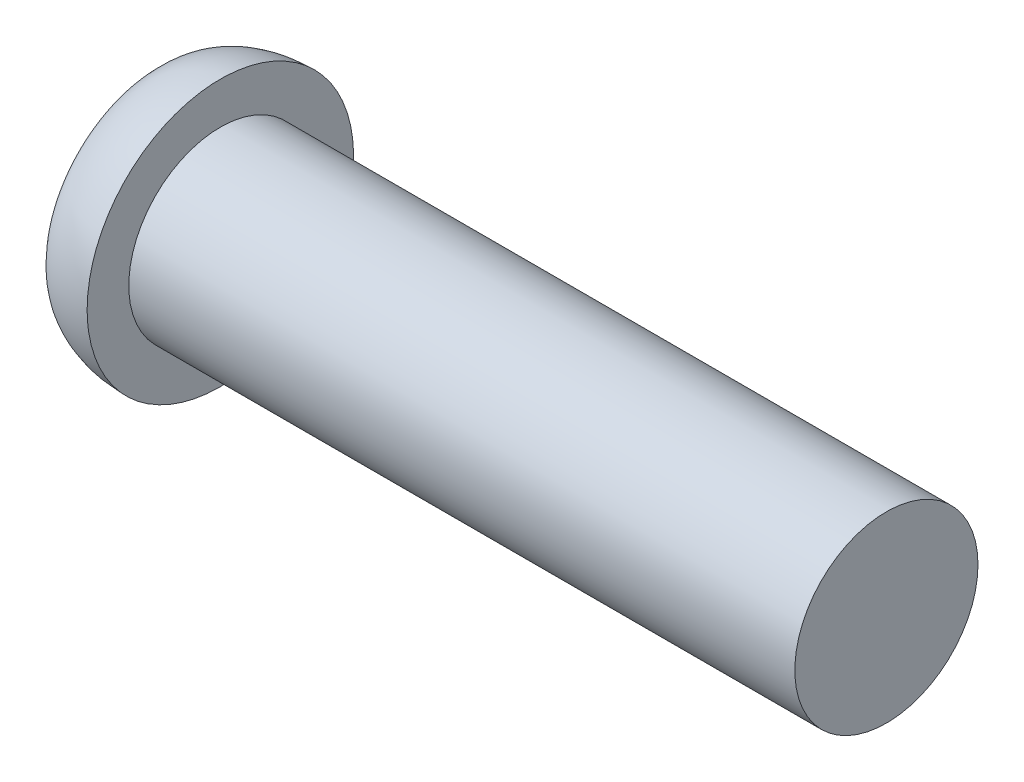
ISO-10303-21;
HEADER;
FILE_DESCRIPTION(('STEP AP214'),'2;1');
FILE_NAME('part.step','',(''),(''),'','','');
FILE_SCHEMA(('AUTOMOTIVE_DESIGN { 1 0 10303 214 1 1 1 1 }'));
ENDSEC;
DATA;
#1=APPLICATION_CONTEXT('core data for automotive mechanical design processes');
#2=APPLICATION_PROTOCOL_DEFINITION('international standard','automotive_design',2000,#1);
#3=PRODUCT_CONTEXT('',#1,'mechanical');
#4=PRODUCT('Part','Part','',(#3));
#5=PRODUCT_RELATED_PRODUCT_CATEGORY('part','',(#4));
#6=PRODUCT_DEFINITION_FORMATION('','',#4);
#7=PRODUCT_DEFINITION_CONTEXT('part definition',#1,'design');
#8=PRODUCT_DEFINITION('design','',#6,#7);
#9=PRODUCT_DEFINITION_SHAPE('','',#8);
#10=(LENGTH_UNIT() NAMED_UNIT(*) SI_UNIT(.MILLI.,.METRE.));
#11=(NAMED_UNIT(*) PLANE_ANGLE_UNIT() SI_UNIT($,.RADIAN.));
#12=(NAMED_UNIT(*) SI_UNIT($,.STERADIAN.) SOLID_ANGLE_UNIT());
#13=UNCERTAINTY_MEASURE_WITH_UNIT(LENGTH_MEASURE(1.E-05),#10,'distance_accuracy_value','');
#14=(GEOMETRIC_REPRESENTATION_CONTEXT(3) GLOBAL_UNCERTAINTY_ASSIGNED_CONTEXT((#13)) GLOBAL_UNIT_ASSIGNED_CONTEXT((#10,
#11,#12)) REPRESENTATION_CONTEXT('',''));
#15=CARTESIAN_POINT('',(0.,0.,0.));
#16=DIRECTION('',(0.,0.,1.));
#17=DIRECTION('',(1.,0.,0.));
#18=AXIS2_PLACEMENT_3D('',#15,#16,#17);
#19=CARTESIAN_POINT('',(20.,0.,0.));
#20=DIRECTION('',(-1.,0.,0.));
#21=DIRECTION('',(0.,0.,1.));
#22=AXIS2_PLACEMENT_3D('',#19,#20,#21);
#23=CYLINDRICAL_SURFACE('',#22,2.75);
#24=CARTESIAN_POINT('',(20.,0.,0.));
#25=DIRECTION('',(1.,0.,0.));
#26=DIRECTION('',(0.,0.,-1.));
#27=AXIS2_PLACEMENT_3D('',#24,#25,#26);
#28=CIRCLE('',#27,2.75);
#29=CARTESIAN_POINT('',(20.,0.,-2.75));
#30=VERTEX_POINT('',#29);
#31=EDGE_CURVE('E57',#30,#30,#28,.T.);
#32=ORIENTED_EDGE('',*,*,#31,.F.);
#33=EDGE_LOOP('',(#32));
#34=FACE_BOUND('',#33,.T.);
#35=CARTESIAN_POINT('',(0.,0.,0.));
#36=DIRECTION('',(1.,0.,0.));
#37=DIRECTION('',(0.,0.,-1.));
#38=AXIS2_PLACEMENT_3D('',#35,#36,#37);
#39=CIRCLE('',#38,2.75);
#40=CARTESIAN_POINT('',(0.,0.,-2.75));
#41=VERTEX_POINT('',#40);
#42=EDGE_CURVE('E63',#41,#41,#39,.T.);
#43=ORIENTED_EDGE('',*,*,#42,.T.);
#44=EDGE_LOOP('',(#43));
#45=FACE_BOUND('',#44,.T.);
#46=ADVANCED_FACE('F42',(#34,#45),#23,.T.);
#47=CARTESIAN_POINT('',(20.,0.,0.));
#48=DIRECTION('',(1.,0.,0.));
#49=DIRECTION('',(0.,0.,-1.));
#50=AXIS2_PLACEMENT_3D('',#47,#48,#49);
#51=PLANE('',#50);
#52=ORIENTED_EDGE('',*,*,#31,.T.);
#53=EDGE_LOOP('',(#52));
#54=FACE_BOUND('',#53,.T.);
#55=ADVANCED_FACE('F86',(#54),#51,.T.);
#56=CARTESIAN_POINT('',(-2.,0.,0.));
#57=DIRECTION('',(-1.,0.,0.));
#58=DIRECTION('',(0.,0.,1.));
#59=AXIS2_PLACEMENT_3D('',#56,#57,#58);
#60=PLANE('',#59);
#61=CARTESIAN_POINT('',(-2.,0.,3.));
#62=CARTESIAN_POINT('',(-2.,-0.392699074426904,3.));
#63=CARTESIAN_POINT('',(-2.,-0.785243659796482,2.92191802722197));
#64=CARTESIAN_POINT('',(-2.,-1.51085693439406,2.62135916784575));
#65=CARTESIAN_POINT('',(-2.,-1.84364016506699,2.3990005220523));
#66=CARTESIAN_POINT('',(-2.,-2.39900052205231,1.84364016506698));
#67=CARTESIAN_POINT('',(-2.,-2.62135916784575,1.51085693439406));
#68=CARTESIAN_POINT('',(-2.,-2.92191802722197,0.785243659796473));
#69=CARTESIAN_POINT('',(-2.,-3.,0.392699074426524));
#70=CARTESIAN_POINT('',(-2.,-3.,-0.392699074426515));
#71=CARTESIAN_POINT('',(-2.,-2.92191802722206,-0.785243659796482));
#72=CARTESIAN_POINT('',(-2.,-2.62135916784566,-1.51085693439406));
#73=CARTESIAN_POINT('',(-2.,-2.39900052205225,-1.84364016506695));
#74=CARTESIAN_POINT('',(-2.,-1.84364016506704,-2.39900052205233));
#75=CARTESIAN_POINT('',(-2.,-1.51085693439411,-2.62135916784572));
#76=CARTESIAN_POINT('',(-2.,-0.785243659796416,-2.921918027222));
#77=CARTESIAN_POINT('',(-2.,-0.392699074426519,-3.));
#78=CARTESIAN_POINT('',(-2.,0.392699074426519,-3.));
#79=CARTESIAN_POINT('',(-2.,0.78524365979651,-2.921918027222));
#80=CARTESIAN_POINT('',(-2.,1.51085693439404,-2.62135916784572));
#81=CARTESIAN_POINT('',(-2.,1.84364016506695,-2.39900052205233));
#82=CARTESIAN_POINT('',(-2.,2.39900052205233,-1.84364016506695));
#83=CARTESIAN_POINT('',(-2.,2.62135916784572,-1.51085693439408));
#84=CARTESIAN_POINT('',(-2.,2.921918027222,-0.785243659796464));
#85=CARTESIAN_POINT('',(-2.,3.,-0.392699074426519));
#86=CARTESIAN_POINT('',(-2.,3.,0.392699074426519));
#87=CARTESIAN_POINT('',(-2.,2.92191802722209,0.785243659796462));
#88=CARTESIAN_POINT('',(-2.,2.62135916784563,1.51085693439407));
#89=CARTESIAN_POINT('',(-2.,2.39900052205225,1.84364016506695));
#90=CARTESIAN_POINT('',(-2.,1.84364016506704,2.39900052205233));
#91=CARTESIAN_POINT('',(-2.,1.51085693439406,2.62135916784574));
#92=CARTESIAN_POINT('',(-2.,0.785243659796481,2.92191802722198));
#93=CARTESIAN_POINT('',(-2.,0.392699074426903,3.));
#94=CARTESIAN_POINT('',(-2.,0.,3.));
#95=(BOUNDED_CURVE() B_SPLINE_CURVE(3,(#61,#62,#63,#64,#65,#66,#67,#68,#69,#70,#71,#72,#73,#74,
#75,#76,#77,#78,#79,#80,#81,#82,#83,#84,#85,#86,#87,#88,#89,#90,#91,#92,#93,#94),.UNSPECIFIED.,
.T.,.F.) B_SPLINE_CURVE_WITH_KNOTS((4,2,2,2,2,2,2,2,2,2,2,2,2,2,2,2,4),(0.,0.392699081698725,
0.785398163397448,1.17809724509617,1.5707963267949,1.96349540849362,2.35619449019234,
2.74889357189107,3.14159265358979,3.53429173528852,3.92699081698724,4.31968989868597,
4.71238898038469,5.10508806208341,5.49778714378214,5.89048622548086,6.28318530717959),
.UNSPECIFIED.) CURVE() GEOMETRIC_REPRESENTATION_ITEM() RATIONAL_B_SPLINE_CURVE((1.,1.,1.,1.,1.,
1.,1.,1.,1.,1.,1.,1.,1.,1.,1.,1.,1.,1.,1.,1.,1.,1.,1.,1.,1.,1.,1.,1.,1.,1.,1.,1.,1.,1.)) REPRESENTATION_ITEM(''));
#96=CARTESIAN_POINT('',(-2.,0.,3.));
#97=VERTEX_POINT('',#96);
#98=EDGE_CURVE('E11',#97,#97,#95,.F.);
#99=ORIENTED_EDGE('',*,*,#98,.T.);
#100=EDGE_LOOP('',(#99));
#101=FACE_BOUND('',#100,.T.);
#102=ADVANCED_FACE('F77',(#101),#60,.T.);
#103=CARTESIAN_POINT('',(0.,0.,0.));
#104=DIRECTION('',(-1.,0.,0.));
#105=DIRECTION('',(0.,0.,1.));
#106=AXIS2_PLACEMENT_3D('',#103,#104,#105);
#107=PLANE('',#106);
#108=ORIENTED_EDGE('',*,*,#42,.F.);
#109=EDGE_LOOP('',(#108));
#110=FACE_BOUND('',#109,.T.);
#111=CARTESIAN_POINT('',(0.,0.,4.));
#112=CARTESIAN_POINT('',(0.,0.523598765902538,4.));
#113=CARTESIAN_POINT('',(0.,1.04699154639528,3.89589070296267));
#114=CARTESIAN_POINT('',(0.,2.01447591252544,3.49514555712762));
#115=CARTESIAN_POINT('',(0.,2.45818688675601,3.19866736273637));
#116=CARTESIAN_POINT('',(0.,3.19866736273637,2.45818688675601));
#117=CARTESIAN_POINT('',(0.,3.49514555712762,2.01447591252544));
#118=CARTESIAN_POINT('',(0.,3.89589070296267,1.04699154639527));
#119=CARTESIAN_POINT('',(0.,4.,0.523598765902026));
#120=CARTESIAN_POINT('',(0.,4.,-0.523598765902025));
#121=CARTESIAN_POINT('',(0.,3.89589070296266,-1.04699154639531));
#122=CARTESIAN_POINT('',(0.,3.49514555712764,-2.01447591252541));
#123=CARTESIAN_POINT('',(0.,3.19866736273646,-2.45818688675593));
#124=CARTESIAN_POINT('',(0.,2.45818688675592,-3.19866736273646));
#125=CARTESIAN_POINT('',(0.,2.01447591252541,-3.49514555712763));
#126=CARTESIAN_POINT('',(0.,1.04699154639532,-3.89589070296266));
#127=CARTESIAN_POINT('',(0.,0.523598765902026,-4.));
#128=CARTESIAN_POINT('',(0.,-0.523598765902025,-4.));
#129=CARTESIAN_POINT('',(0.,-1.04699154639527,-3.89589070296267));
#130=CARTESIAN_POINT('',(0.,-2.01447591252544,-3.49514555712762));
#131=CARTESIAN_POINT('',(0.,-2.45818688675597,-3.19866736273641));
#132=CARTESIAN_POINT('',(0.,-3.19866736273642,-2.45818688675596));
#133=CARTESIAN_POINT('',(0.,-3.49514555712761,-2.01447591252547));
#134=CARTESIAN_POINT('',(0.,-3.89589070296268,-1.04699154639526));
#135=CARTESIAN_POINT('',(0.,-4.,-0.52359876590202));
#136=CARTESIAN_POINT('',(0.,-4.,0.523598765902032));
#137=CARTESIAN_POINT('',(0.,-3.89589070296264,1.04699154639534));
#138=CARTESIAN_POINT('',(0.,-3.49514555712766,2.01447591252536));
#139=CARTESIAN_POINT('',(0.,-3.1986673627364,2.45818688675598));
#140=CARTESIAN_POINT('',(0.,-2.458186886756,3.19866736273638));
#141=CARTESIAN_POINT('',(0.,-2.01447591252544,3.49514555712762));
#142=CARTESIAN_POINT('',(0.,-1.04699154639529,3.89589070296267));
#143=CARTESIAN_POINT('',(0.,-0.523598765902538,4.));
#144=CARTESIAN_POINT('',(0.,0.,4.));
#145=(BOUNDED_CURVE() B_SPLINE_CURVE(3,(#111,#112,#113,#114,#115,#116,#117,#118,#119,#120,#121,
#122,#123,#124,#125,#126,#127,#128,#129,#130,#131,#132,#133,#134,#135,#136,#137,#138,#139,#140,
#141,#142,#143,#144),.UNSPECIFIED.,.T.,.F.) B_SPLINE_CURVE_WITH_KNOTS((4,2,2,2,2,2,2,2,2,2,2,2,
2,2,2,2,4),(0.,0.392699081698724,0.785398163397448,1.17809724509617,1.5707963267949,
1.96349540849362,2.35619449019234,2.74889357189107,3.14159265358979,3.53429173528852,
3.92699081698724,4.31968989868597,4.71238898038469,5.10508806208341,5.49778714378214,
5.89048622548086,6.28318530717959),
.UNSPECIFIED.) CURVE() GEOMETRIC_REPRESENTATION_ITEM() RATIONAL_B_SPLINE_CURVE((1.,1.,1.,1.,1.,
1.,1.,1.,1.,1.,1.,1.,1.,1.,1.,1.,1.,1.,1.,1.,1.,1.,1.,1.,1.,1.,1.,1.,1.,1.,1.,1.,1.,1.)) REPRESENTATION_ITEM(''));
#146=CARTESIAN_POINT('',(0.,0.,4.));
#147=VERTEX_POINT('',#146);
#148=EDGE_CURVE('E69',#147,#147,#145,.T.);
#149=ORIENTED_EDGE('',*,*,#148,.F.);
#150=EDGE_LOOP('',(#149));
#151=FACE_BOUND('',#150,.T.);
#152=ADVANCED_FACE('F85',(#110,#151),#107,.F.);
#153=CARTESIAN_POINT('',(-2.,0.,3.));
#154=CARTESIAN_POINT('',(-2.,0.392699074426903,3.));
#155=CARTESIAN_POINT('',(-2.,0.785243659796481,2.92191802722198));
#156=CARTESIAN_POINT('',(-2.,1.51085693439406,2.62135916784574));
#157=CARTESIAN_POINT('',(-2.,1.84364016506704,2.39900052205233));
#158=CARTESIAN_POINT('',(-2.,2.39900052205225,1.84364016506695));
#159=CARTESIAN_POINT('',(-2.,2.62135916784563,1.51085693439407));
#160=CARTESIAN_POINT('',(-2.,2.92191802722209,0.785243659796462));
#161=CARTESIAN_POINT('',(-2.,3.,0.392699074426519));
#162=CARTESIAN_POINT('',(-2.,3.,-0.392699074426519));
#163=CARTESIAN_POINT('',(-2.,2.921918027222,-0.785243659796464));
#164=CARTESIAN_POINT('',(-2.,2.62135916784572,-1.51085693439408));
#165=CARTESIAN_POINT('',(-2.,2.39900052205233,-1.84364016506695));
#166=CARTESIAN_POINT('',(-2.,1.84364016506695,-2.39900052205233));
#167=CARTESIAN_POINT('',(-2.,1.51085693439404,-2.62135916784572));
#168=CARTESIAN_POINT('',(-2.,0.78524365979651,-2.921918027222));
#169=CARTESIAN_POINT('',(-2.,0.392699074426519,-3.));
#170=CARTESIAN_POINT('',(-2.,-0.392699074426519,-3.));
#171=CARTESIAN_POINT('',(-2.,-0.785243659796416,-2.921918027222));
#172=CARTESIAN_POINT('',(-2.,-1.51085693439411,-2.62135916784572));
#173=CARTESIAN_POINT('',(-2.,-1.84364016506704,-2.39900052205233));
#174=CARTESIAN_POINT('',(-2.,-2.39900052205225,-1.84364016506695));
#175=CARTESIAN_POINT('',(-2.,-2.62135916784566,-1.51085693439406));
#176=CARTESIAN_POINT('',(-2.,-2.92191802722206,-0.785243659796482));
#177=CARTESIAN_POINT('',(-2.,-3.,-0.392699074426515));
#178=CARTESIAN_POINT('',(-2.,-3.,0.392699074426524));
#179=CARTESIAN_POINT('',(-2.,-2.92191802722197,0.785243659796473));
#180=CARTESIAN_POINT('',(-2.,-2.62135916784575,1.51085693439406));
#181=CARTESIAN_POINT('',(-2.,-2.39900052205231,1.84364016506698));
#182=CARTESIAN_POINT('',(-2.,-1.84364016506699,2.3990005220523));
#183=CARTESIAN_POINT('',(-2.,-1.51085693439406,2.62135916784575));
#184=CARTESIAN_POINT('',(-2.,-0.785243659796482,2.92191802722197));
#185=CARTESIAN_POINT('',(-2.,-0.392699074426904,3.));
#186=CARTESIAN_POINT('',(-2.,0.,3.));
#187=CARTESIAN_POINT('',(-2.,0.,4.));
#188=CARTESIAN_POINT('',(-2.,0.523598765902538,4.));
#189=CARTESIAN_POINT('',(-2.,1.04699154639528,3.89589070296266));
#190=CARTESIAN_POINT('',(-2.,2.01447591252544,3.49514555712763));
#191=CARTESIAN_POINT('',(-2.,2.45818688675597,3.19866736273633));
#192=CARTESIAN_POINT('',(-2.,3.19866736273642,2.45818688675605));
#193=CARTESIAN_POINT('',(-2.,3.4951455571276,2.01447591252543));
#194=CARTESIAN_POINT('',(-2.,3.8958907029627,1.04699154639528));
#195=CARTESIAN_POINT('',(-2.,4.,0.523598765902026));
#196=CARTESIAN_POINT('',(-2.,4.,-0.523598765902025));
#197=CARTESIAN_POINT('',(-2.,3.8958907029627,-1.04699154639533));
#198=CARTESIAN_POINT('',(-2.,3.4951455571276,-2.01447591252539));
#199=CARTESIAN_POINT('',(-2.,3.19866736273641,-2.45818688675588));
#200=CARTESIAN_POINT('',(-2.,2.45818688675596,-3.1986673627365));
#201=CARTESIAN_POINT('',(-2.,2.0144759125254,-3.49514555712759));
#202=CARTESIAN_POINT('',(-2.,1.04699154639533,-3.89589070296269));
#203=CARTESIAN_POINT('',(-2.,0.523598765902026,-4.));
#204=CARTESIAN_POINT('',(-2.,-0.523598765902025,-4.));
#205=CARTESIAN_POINT('',(-2.,-1.04699154639528,-3.8958907029627));
#206=CARTESIAN_POINT('',(-2.,-2.01447591252543,-3.4951455571276));
#207=CARTESIAN_POINT('',(-2.,-2.45818688675597,-3.19866736273641));
#208=CARTESIAN_POINT('',(-2.,-3.19866736273642,-2.45818688675596));
#209=CARTESIAN_POINT('',(-2.,-3.49514555712752,-2.01447591252552));
#210=CARTESIAN_POINT('',(-2.,-3.89589070296277,-1.04699154639521));
#211=CARTESIAN_POINT('',(-2.,-4.00000000000017,-0.52359876590202));
#212=CARTESIAN_POINT('',(-2.,-3.99999999999983,0.523598765902032));
#213=CARTESIAN_POINT('',(-2.,-3.8958907029626,1.04699154639533));
#214=CARTESIAN_POINT('',(-2.,-3.4951455571277,2.01447591252538));
#215=CARTESIAN_POINT('',(-2.,-3.19866736273644,2.45818688675602));
#216=CARTESIAN_POINT('',(-2.,-2.45818688675596,3.19866736273634));
#217=CARTESIAN_POINT('',(-2.,-2.01447591252552,3.49514555712761));
#218=CARTESIAN_POINT('',(-2.,-1.04699154639521,3.89589070296268));
#219=CARTESIAN_POINT('',(-2.,-0.523598765902538,4.));
#220=CARTESIAN_POINT('',(-2.,0.,4.));
#221=CARTESIAN_POINT('',(0.,0.,4.));
#222=CARTESIAN_POINT('',(0.,0.523598765902538,4.));
#223=CARTESIAN_POINT('',(0.,1.04699154639528,3.89589070296267));
#224=CARTESIAN_POINT('',(0.,2.01447591252544,3.49514555712762));
#225=CARTESIAN_POINT('',(0.,2.45818688675601,3.19866736273637));
#226=CARTESIAN_POINT('',(0.,3.19866736273637,2.45818688675601));
#227=CARTESIAN_POINT('',(0.,3.49514555712762,2.01447591252544));
#228=CARTESIAN_POINT('',(0.,3.89589070296267,1.04699154639527));
#229=CARTESIAN_POINT('',(0.,4.,0.523598765902026));
#230=CARTESIAN_POINT('',(0.,4.,-0.523598765902025));
#231=CARTESIAN_POINT('',(0.,3.89589070296266,-1.04699154639531));
#232=CARTESIAN_POINT('',(0.,3.49514555712764,-2.01447591252541));
#233=CARTESIAN_POINT('',(0.,3.19866736273646,-2.45818688675593));
#234=CARTESIAN_POINT('',(0.,2.45818688675592,-3.19866736273646));
#235=CARTESIAN_POINT('',(0.,2.01447591252541,-3.49514555712763));
#236=CARTESIAN_POINT('',(0.,1.04699154639532,-3.89589070296266));
#237=CARTESIAN_POINT('',(0.,0.523598765902026,-4.));
#238=CARTESIAN_POINT('',(0.,-0.523598765902025,-4.));
#239=CARTESIAN_POINT('',(0.,-1.04699154639527,-3.89589070296267));
#240=CARTESIAN_POINT('',(0.,-2.01447591252544,-3.49514555712762));
#241=CARTESIAN_POINT('',(0.,-2.45818688675597,-3.19866736273641));
#242=CARTESIAN_POINT('',(0.,-3.19866736273642,-2.45818688675596));
#243=CARTESIAN_POINT('',(0.,-3.49514555712761,-2.01447591252547));
#244=CARTESIAN_POINT('',(0.,-3.89589070296268,-1.04699154639526));
#245=CARTESIAN_POINT('',(0.,-4.,-0.52359876590202));
#246=CARTESIAN_POINT('',(0.,-4.,0.523598765902032));
#247=CARTESIAN_POINT('',(0.,-3.89589070296264,1.04699154639534));
#248=CARTESIAN_POINT('',(0.,-3.49514555712766,2.01447591252536));
#249=CARTESIAN_POINT('',(0.,-3.1986673627364,2.45818688675598));
#250=CARTESIAN_POINT('',(0.,-2.458186886756,3.19866736273638));
#251=CARTESIAN_POINT('',(0.,-2.01447591252544,3.49514555712762));
#252=CARTESIAN_POINT('',(0.,-1.04699154639529,3.89589070296267));
#253=CARTESIAN_POINT('',(0.,-0.523598765902538,4.));
#254=CARTESIAN_POINT('',(0.,0.,4.));
#255=(BOUNDED_SURFACE() B_SPLINE_SURFACE(2,3,((#153,#154,#155,#156,#157,#158,#159,#160,#161,
#162,#163,#164,#165,#166,#167,#168,#169,#170,#171,#172,#173,#174,#175,#176,#177,#178,#179,#180,
#181,#182,#183,#184,#185,#186),(#187,#188,#189,#190,#191,#192,#193,#194,#195,#196,#197,#198,
#199,#200,#201,#202,#203,#204,#205,#206,#207,#208,#209,#210,#211,#212,#213,#214,#215,#216,#217,
#218,#219,#220),(#221,#222,#223,#224,#225,#226,#227,#228,#229,#230,#231,#232,#233,#234,#235,
#236,#237,#238,#239,#240,#241,#242,#243,#244,#245,#246,#247,#248,#249,#250,#251,#252,#253,
#254)),.UNSPECIFIED.,.F.,.T.,.F.) B_SPLINE_SURFACE_WITH_KNOTS((3,3),(4,2,2,2,2,2,2,2,2,2,2,2,2,
2,2,2,4),(0.,1.),(0.,0.392699081698724,0.785398163397448,1.17809724509617,1.5707963267949,
1.96349540849362,2.35619449019234,2.74889357189107,3.14159265358979,3.53429173528852,
3.92699081698724,4.31968989868597,4.71238898038469,5.10508806208341,5.49778714378214,
5.89048622548086,6.28318530717959),
.UNSPECIFIED.) GEOMETRIC_REPRESENTATION_ITEM() RATIONAL_B_SPLINE_SURFACE(((1.,1.,1.,1.,1.,1.,1.,
1.,1.,1.,1.,1.,1.,1.,1.,1.,1.,1.,1.,1.,1.,1.,1.,1.,1.,1.,1.,1.,1.,1.,1.,1.,1.,1.),
(0.707106781186547,0.707106781186547,0.707106781186548,0.707106781186548,0.707106781186548,
0.707106781186548,0.707106781186548,0.707106781186548,0.707106781186547,0.707106781186547,
0.707106781186547,0.707106781186547,0.707106781186548,0.707106781186548,0.707106781186548,
0.707106781186548,0.707106781186547,0.707106781186547,0.707106781186548,0.707106781186548,
0.707106781186548,0.707106781186548,0.707106781186548,0.707106781186548,0.707106781186547,
0.707106781186547,0.707106781186548,0.707106781186548,0.707106781186548,0.707106781186548,
0.707106781186548,0.707106781186548,0.707106781186547,0.707106781186547),(1.,1.,1.,1.,1.,1.,1.,
1.,1.,1.,1.,1.,1.,1.,1.,1.,1.,1.,1.,1.,1.,1.,1.,1.,1.,1.,1.,1.,1.,1.,1.,1.,1.,1.))) REPRESENTATION_ITEM('') SURFACE());
#256=ORIENTED_EDGE('',*,*,#148,.T.);
#257=EDGE_LOOP('',(#256));
#258=FACE_BOUND('',#257,.T.);
#259=ORIENTED_EDGE('',*,*,#98,.F.);
#260=EDGE_LOOP('',(#259));
#261=FACE_BOUND('',#260,.T.);
#262=ADVANCED_FACE('F45',(#258,#261),#255,.T.);
#263=CLOSED_SHELL('',(#46,#55,#102,#152,#262));
#264=MANIFOLD_SOLID_BREP('B2',#263);
#265=ADVANCED_BREP_SHAPE_REPRESENTATION('',(#18,#264),#14);
#266=SHAPE_DEFINITION_REPRESENTATION(#9,#265);
ENDSEC;
END-ISO-10303-21;
